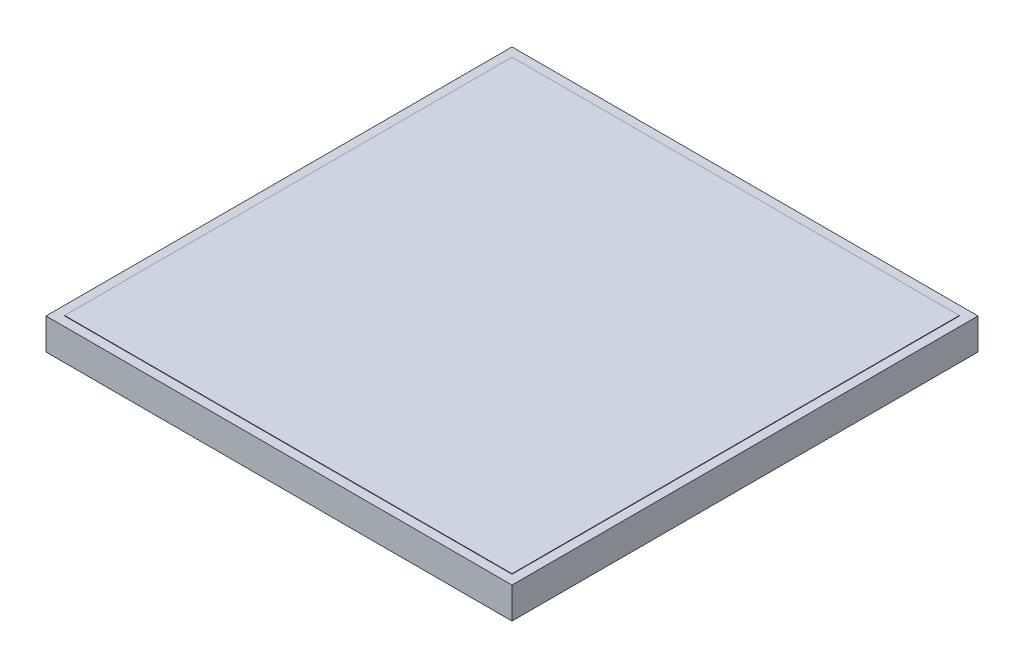
ISO-10303-21;
HEADER;
FILE_DESCRIPTION(('STEP AP214'),'2;1');
FILE_NAME('part.step','',(''),(''),'','','');
FILE_SCHEMA(('AUTOMOTIVE_DESIGN { 1 0 10303 214 1 1 1 1 }'));
ENDSEC;
DATA;
#1=APPLICATION_CONTEXT('core data for automotive mechanical design processes');
#2=APPLICATION_PROTOCOL_DEFINITION('international standard','automotive_design',2000,#1);
#3=PRODUCT_CONTEXT('',#1,'mechanical');
#4=PRODUCT('Part','Part','',(#3));
#5=PRODUCT_RELATED_PRODUCT_CATEGORY('part','',(#4));
#6=PRODUCT_DEFINITION_FORMATION('','',#4);
#7=PRODUCT_DEFINITION_CONTEXT('part definition',#1,'design');
#8=PRODUCT_DEFINITION('design','',#6,#7);
#9=PRODUCT_DEFINITION_SHAPE('','',#8);
#10=(LENGTH_UNIT() NAMED_UNIT(*) SI_UNIT(.MILLI.,.METRE.));
#11=(NAMED_UNIT(*) PLANE_ANGLE_UNIT() SI_UNIT($,.RADIAN.));
#12=(NAMED_UNIT(*) SI_UNIT($,.STERADIAN.) SOLID_ANGLE_UNIT());
#13=UNCERTAINTY_MEASURE_WITH_UNIT(LENGTH_MEASURE(1.E-05),#10,'distance_accuracy_value','');
#14=(GEOMETRIC_REPRESENTATION_CONTEXT(3) GLOBAL_UNCERTAINTY_ASSIGNED_CONTEXT((#13)) GLOBAL_UNIT_ASSIGNED_CONTEXT((#10,
#11,#12)) REPRESENTATION_CONTEXT('',''));
#15=CARTESIAN_POINT('',(0.,0.,0.));
#16=DIRECTION('',(0.,0.,1.));
#17=DIRECTION('',(1.,0.,0.));
#18=AXIS2_PLACEMENT_3D('',#15,#16,#17);
#19=CARTESIAN_POINT('',(5.,0.68,-5.));
#20=DIRECTION('',(-1.,0.,0.));
#21=DIRECTION('',(0.,0.,1.));
#22=AXIS2_PLACEMENT_3D('',#19,#20,#21);
#23=PLANE('',#22);
#24=DIRECTION('',(0.,0.,-1.));
#25=VECTOR('',#24,1.);
#26=CARTESIAN_POINT('',(5.,0.67,5.));
#27=LINE('',#26,#25);
#28=CARTESIAN_POINT('',(5.,0.67,5.));
#29=VERTEX_POINT('',#28);
#30=CARTESIAN_POINT('',(5.,0.67,-5.));
#31=VERTEX_POINT('',#30);
#32=EDGE_CURVE('E142',#29,#31,#27,.T.);
#33=ORIENTED_EDGE('',*,*,#32,.F.);
#34=DIRECTION('',(0.,-1.,0.));
#35=VECTOR('',#34,1.);
#36=CARTESIAN_POINT('',(5.,0.68,5.));
#37=LINE('',#36,#35);
#38=CARTESIAN_POINT('',(5.,0.,5.));
#39=VERTEX_POINT('',#38);
#40=EDGE_CURVE('E158',#29,#39,#37,.T.);
#41=ORIENTED_EDGE('',*,*,#40,.T.);
#42=DIRECTION('',(0.,0.,-1.));
#43=VECTOR('',#42,1.);
#44=CARTESIAN_POINT('',(5.,0.,-5.));
#45=LINE('',#44,#43);
#46=CARTESIAN_POINT('',(5.,0.,-5.));
#47=VERTEX_POINT('',#46);
#48=EDGE_CURVE('E146',#39,#47,#45,.T.);
#49=ORIENTED_EDGE('',*,*,#48,.T.);
#50=DIRECTION('',(0.,-1.,0.));
#51=VECTOR('',#50,1.);
#52=CARTESIAN_POINT('',(5.,0.68,-5.));
#53=LINE('',#52,#51);
#54=EDGE_CURVE('E11',#31,#47,#53,.T.);
#55=ORIENTED_EDGE('',*,*,#54,.F.);
#56=EDGE_LOOP('',(#33,#41,#49,#55));
#57=FACE_BOUND('',#56,.T.);
#58=ADVANCED_FACE('F36',(#57),#23,.F.);
#59=CARTESIAN_POINT('',(-5.,0.68,-5.));
#60=DIRECTION('',(0.,0.,1.));
#61=DIRECTION('',(1.,0.,0.));
#62=AXIS2_PLACEMENT_3D('',#59,#60,#61);
#63=PLANE('',#62);
#64=DIRECTION('',(-1.,0.,0.));
#65=VECTOR('',#64,1.);
#66=CARTESIAN_POINT('',(5.,0.67,-5.));
#67=LINE('',#66,#65);
#68=CARTESIAN_POINT('',(-5.,0.67,-5.));
#69=VERTEX_POINT('',#68);
#70=EDGE_CURVE('E144',#31,#69,#67,.T.);
#71=ORIENTED_EDGE('',*,*,#70,.F.);
#72=ORIENTED_EDGE('',*,*,#54,.T.);
#73=DIRECTION('',(-1.,0.,0.));
#74=VECTOR('',#73,1.);
#75=CARTESIAN_POINT('',(-5.,0.,-5.));
#76=LINE('',#75,#74);
#77=CARTESIAN_POINT('',(-5.,0.,-5.));
#78=VERTEX_POINT('',#77);
#79=EDGE_CURVE('E149',#47,#78,#76,.T.);
#80=ORIENTED_EDGE('',*,*,#79,.T.);
#81=DIRECTION('',(0.,-1.,0.));
#82=VECTOR('',#81,1.);
#83=CARTESIAN_POINT('',(-5.,0.68,-5.));
#84=LINE('',#83,#82);
#85=EDGE_CURVE('E43',#69,#78,#84,.T.);
#86=ORIENTED_EDGE('',*,*,#85,.F.);
#87=EDGE_LOOP('',(#71,#72,#80,#86));
#88=FACE_BOUND('',#87,.T.);
#89=ADVANCED_FACE('F170',(#88),#63,.F.);
#90=CARTESIAN_POINT('',(-5.,0.68,-5.));
#91=DIRECTION('',(1.,0.,0.));
#92=DIRECTION('',(0.,0.,-1.));
#93=AXIS2_PLACEMENT_3D('',#90,#91,#92);
#94=PLANE('',#93);
#95=DIRECTION('',(0.,0.,1.));
#96=VECTOR('',#95,1.);
#97=CARTESIAN_POINT('',(-5.,0.67,5.));
#98=LINE('',#97,#96);
#99=CARTESIAN_POINT('',(-5.,0.67,5.));
#100=VERTEX_POINT('',#99);
#101=EDGE_CURVE('E50',#69,#100,#98,.T.);
#102=ORIENTED_EDGE('',*,*,#101,.F.);
#103=ORIENTED_EDGE('',*,*,#85,.T.);
#104=DIRECTION('',(0.,0.,1.));
#105=VECTOR('',#104,1.);
#106=CARTESIAN_POINT('',(-5.,0.,-5.));
#107=LINE('',#106,#105);
#108=CARTESIAN_POINT('',(-5.,0.,5.));
#109=VERTEX_POINT('',#108);
#110=EDGE_CURVE('E152',#78,#109,#107,.T.);
#111=ORIENTED_EDGE('',*,*,#110,.T.);
#112=DIRECTION('',(0.,-1.,0.));
#113=VECTOR('',#112,1.);
#114=CARTESIAN_POINT('',(-5.,0.68,5.));
#115=LINE('',#114,#113);
#116=EDGE_CURVE('E160',#100,#109,#115,.T.);
#117=ORIENTED_EDGE('',*,*,#116,.F.);
#118=EDGE_LOOP('',(#102,#103,#111,#117));
#119=FACE_BOUND('',#118,.T.);
#120=ADVANCED_FACE('F163',(#119),#94,.F.);
#121=CARTESIAN_POINT('',(-5.,0.68,5.));
#122=DIRECTION('',(0.,0.,-1.));
#123=DIRECTION('',(-1.,0.,0.));
#124=AXIS2_PLACEMENT_3D('',#121,#122,#123);
#125=PLANE('',#124);
#126=DIRECTION('',(1.,0.,0.));
#127=VECTOR('',#126,1.);
#128=CARTESIAN_POINT('',(5.,0.67,5.));
#129=LINE('',#128,#127);
#130=EDGE_CURVE('E140',#100,#29,#129,.T.);
#131=ORIENTED_EDGE('',*,*,#130,.F.);
#132=ORIENTED_EDGE('',*,*,#116,.T.);
#133=DIRECTION('',(1.,0.,0.));
#134=VECTOR('',#133,1.);
#135=CARTESIAN_POINT('',(-5.,0.,5.));
#136=LINE('',#135,#134);
#137=EDGE_CURVE('E155',#109,#39,#136,.T.);
#138=ORIENTED_EDGE('',*,*,#137,.T.);
#139=ORIENTED_EDGE('',*,*,#40,.F.);
#140=EDGE_LOOP('',(#131,#132,#138,#139));
#141=FACE_BOUND('',#140,.T.);
#142=ADVANCED_FACE('F177',(#141),#125,.F.);
#143=CARTESIAN_POINT('',(0.,0.,0.));
#144=DIRECTION('',(0.,1.,0.));
#145=DIRECTION('',(0.,0.,1.));
#146=AXIS2_PLACEMENT_3D('',#143,#144,#145);
#147=PLANE('',#146);
#148=ORIENTED_EDGE('',*,*,#48,.F.);
#149=ORIENTED_EDGE('',*,*,#137,.F.);
#150=ORIENTED_EDGE('',*,*,#110,.F.);
#151=ORIENTED_EDGE('',*,*,#79,.F.);
#152=EDGE_LOOP('',(#148,#149,#150,#151));
#153=FACE_BOUND('',#152,.T.);
#154=ADVANCED_FACE('F174',(#153),#147,.F.);
#155=CARTESIAN_POINT('',(0.,0.67,0.));
#156=DIRECTION('',(0.,1.,0.));
#157=DIRECTION('',(0.,0.,1.));
#158=AXIS2_PLACEMENT_3D('',#155,#156,#157);
#159=PLANE('',#158);
#160=DIRECTION('',(-1.,0.,0.));
#161=VECTOR('',#160,1.);
#162=CARTESIAN_POINT('',(4.8,0.67,-4.8));
#163=LINE('',#162,#161);
#164=CARTESIAN_POINT('',(4.8,0.67,-4.8));
#165=VERTEX_POINT('',#164);
#166=CARTESIAN_POINT('',(-4.8,0.67,-4.8));
#167=VERTEX_POINT('',#166);
#168=EDGE_CURVE('E111',#165,#167,#163,.T.);
#169=ORIENTED_EDGE('',*,*,#168,.F.);
#170=DIRECTION('',(0.,0.,-1.));
#171=VECTOR('',#170,1.);
#172=CARTESIAN_POINT('',(4.8,0.67,4.8));
#173=LINE('',#172,#171);
#174=CARTESIAN_POINT('',(4.8,0.67,4.8));
#175=VERTEX_POINT('',#174);
#176=EDGE_CURVE('E120',#175,#165,#173,.T.);
#177=ORIENTED_EDGE('',*,*,#176,.F.);
#178=DIRECTION('',(1.,0.,0.));
#179=VECTOR('',#178,1.);
#180=CARTESIAN_POINT('',(4.8,0.67,4.8));
#181=LINE('',#180,#179);
#182=CARTESIAN_POINT('',(-4.8,0.67,4.8));
#183=VERTEX_POINT('',#182);
#184=EDGE_CURVE('E103',#183,#175,#181,.T.);
#185=ORIENTED_EDGE('',*,*,#184,.F.);
#186=DIRECTION('',(0.,0.,1.));
#187=VECTOR('',#186,1.);
#188=CARTESIAN_POINT('',(-4.8,0.67,4.8));
#189=LINE('',#188,#187);
#190=EDGE_CURVE('E117',#167,#183,#189,.T.);
#191=ORIENTED_EDGE('',*,*,#190,.F.);
#192=EDGE_LOOP('',(#169,#177,#185,#191));
#193=FACE_BOUND('',#192,.T.);
#194=ORIENTED_EDGE('',*,*,#101,.T.);
#195=ORIENTED_EDGE('',*,*,#130,.T.);
#196=ORIENTED_EDGE('',*,*,#32,.T.);
#197=ORIENTED_EDGE('',*,*,#70,.T.);
#198=EDGE_LOOP('',(#194,#195,#196,#197));
#199=FACE_BOUND('',#198,.T.);
#200=ADVANCED_FACE('F116',(#193,#199),#159,.T.);
#201=CARTESIAN_POINT('',(-4.8,0.67,4.8));
#202=DIRECTION('',(-1.,0.,0.));
#203=DIRECTION('',(0.,0.,1.));
#204=AXIS2_PLACEMENT_3D('',#201,#202,#203);
#205=PLANE('',#204);
#206=DIRECTION('',(0.,0.,1.));
#207=VECTOR('',#206,1.);
#208=CARTESIAN_POINT('',(-4.8,0.68,4.8));
#209=LINE('',#208,#207);
#210=CARTESIAN_POINT('',(-4.8,0.68,-4.8));
#211=VERTEX_POINT('',#210);
#212=CARTESIAN_POINT('',(-4.8,0.68,4.8));
#213=VERTEX_POINT('',#212);
#214=EDGE_CURVE('E131',#211,#213,#209,.T.);
#215=ORIENTED_EDGE('',*,*,#214,.F.);
#216=DIRECTION('',(0.,1.,0.));
#217=VECTOR('',#216,1.);
#218=CARTESIAN_POINT('',(-4.8,0.67,-4.8));
#219=LINE('',#218,#217);
#220=EDGE_CURVE('E123',#167,#211,#219,.T.);
#221=ORIENTED_EDGE('',*,*,#220,.F.);
#222=ORIENTED_EDGE('',*,*,#190,.T.);
#223=DIRECTION('',(0.,1.,0.));
#224=VECTOR('',#223,1.);
#225=CARTESIAN_POINT('',(-4.8,0.67,4.8));
#226=LINE('',#225,#224);
#227=EDGE_CURVE('E100',#183,#213,#226,.T.);
#228=ORIENTED_EDGE('',*,*,#227,.T.);
#229=EDGE_LOOP('',(#215,#221,#222,#228));
#230=FACE_BOUND('',#229,.T.);
#231=ADVANCED_FACE('F122',(#230),#205,.T.);
#232=CARTESIAN_POINT('',(4.8,0.67,-4.8));
#233=DIRECTION('',(0.,0.,-1.));
#234=DIRECTION('',(-1.,0.,0.));
#235=AXIS2_PLACEMENT_3D('',#232,#233,#234);
#236=PLANE('',#235);
#237=DIRECTION('',(-1.,0.,0.));
#238=VECTOR('',#237,1.);
#239=CARTESIAN_POINT('',(4.8,0.68,-4.8));
#240=LINE('',#239,#238);
#241=CARTESIAN_POINT('',(4.8,0.68,-4.8));
#242=VERTEX_POINT('',#241);
#243=EDGE_CURVE('E124',#242,#211,#240,.T.);
#244=ORIENTED_EDGE('',*,*,#243,.F.);
#245=DIRECTION('',(0.,1.,0.));
#246=VECTOR('',#245,1.);
#247=CARTESIAN_POINT('',(4.8,0.67,-4.8));
#248=LINE('',#247,#246);
#249=EDGE_CURVE('E136',#165,#242,#248,.T.);
#250=ORIENTED_EDGE('',*,*,#249,.F.);
#251=ORIENTED_EDGE('',*,*,#168,.T.);
#252=ORIENTED_EDGE('',*,*,#220,.T.);
#253=EDGE_LOOP('',(#244,#250,#251,#252));
#254=FACE_BOUND('',#253,.T.);
#255=ADVANCED_FACE('F201',(#254),#236,.T.);
#256=CARTESIAN_POINT('',(4.8,0.67,4.8));
#257=DIRECTION('',(1.,0.,0.));
#258=DIRECTION('',(0.,0.,-1.));
#259=AXIS2_PLACEMENT_3D('',#256,#257,#258);
#260=PLANE('',#259);
#261=DIRECTION('',(0.,0.,-1.));
#262=VECTOR('',#261,1.);
#263=CARTESIAN_POINT('',(4.8,0.68,4.8));
#264=LINE('',#263,#262);
#265=CARTESIAN_POINT('',(4.8,0.68,4.8));
#266=VERTEX_POINT('',#265);
#267=EDGE_CURVE('E58',#266,#242,#264,.T.);
#268=ORIENTED_EDGE('',*,*,#267,.F.);
#269=DIRECTION('',(0.,1.,0.));
#270=VECTOR('',#269,1.);
#271=CARTESIAN_POINT('',(4.8,0.67,4.8));
#272=LINE('',#271,#270);
#273=EDGE_CURVE('E110',#175,#266,#272,.T.);
#274=ORIENTED_EDGE('',*,*,#273,.F.);
#275=ORIENTED_EDGE('',*,*,#176,.T.);
#276=ORIENTED_EDGE('',*,*,#249,.T.);
#277=EDGE_LOOP('',(#268,#274,#275,#276));
#278=FACE_BOUND('',#277,.T.);
#279=ADVANCED_FACE('F204',(#278),#260,.T.);
#280=CARTESIAN_POINT('',(4.8,0.67,4.8));
#281=DIRECTION('',(0.,0.,1.));
#282=DIRECTION('',(1.,0.,0.));
#283=AXIS2_PLACEMENT_3D('',#280,#281,#282);
#284=PLANE('',#283);
#285=DIRECTION('',(1.,0.,0.));
#286=VECTOR('',#285,1.);
#287=CARTESIAN_POINT('',(4.8,0.68,4.8));
#288=LINE('',#287,#286);
#289=EDGE_CURVE('E105',#213,#266,#288,.T.);
#290=ORIENTED_EDGE('',*,*,#289,.F.);
#291=ORIENTED_EDGE('',*,*,#227,.F.);
#292=ORIENTED_EDGE('',*,*,#184,.T.);
#293=ORIENTED_EDGE('',*,*,#273,.T.);
#294=EDGE_LOOP('',(#290,#291,#292,#293));
#295=FACE_BOUND('',#294,.T.);
#296=ADVANCED_FACE('F102',(#295),#284,.T.);
#297=CARTESIAN_POINT('',(0.,0.68,0.));
#298=DIRECTION('',(0.,1.,0.));
#299=DIRECTION('',(0.,0.,1.));
#300=AXIS2_PLACEMENT_3D('',#297,#298,#299);
#301=PLANE('',#300);
#302=ORIENTED_EDGE('',*,*,#243,.T.);
#303=ORIENTED_EDGE('',*,*,#214,.T.);
#304=ORIENTED_EDGE('',*,*,#289,.T.);
#305=ORIENTED_EDGE('',*,*,#267,.T.);
#306=EDGE_LOOP('',(#302,#303,#304,#305));
#307=FACE_BOUND('',#306,.T.);
#308=ADVANCED_FACE('F193',(#307),#301,.T.);
#309=CLOSED_SHELL('',(#58,#89,#120,#142,#154,#200,#231,#255,#279,#296,#308));
#310=MANIFOLD_SOLID_BREP('B2',#309);
#311=ADVANCED_BREP_SHAPE_REPRESENTATION('',(#18,#310),#14);
#312=SHAPE_DEFINITION_REPRESENTATION(#9,#311);
ENDSEC;
END-ISO-10303-21;
